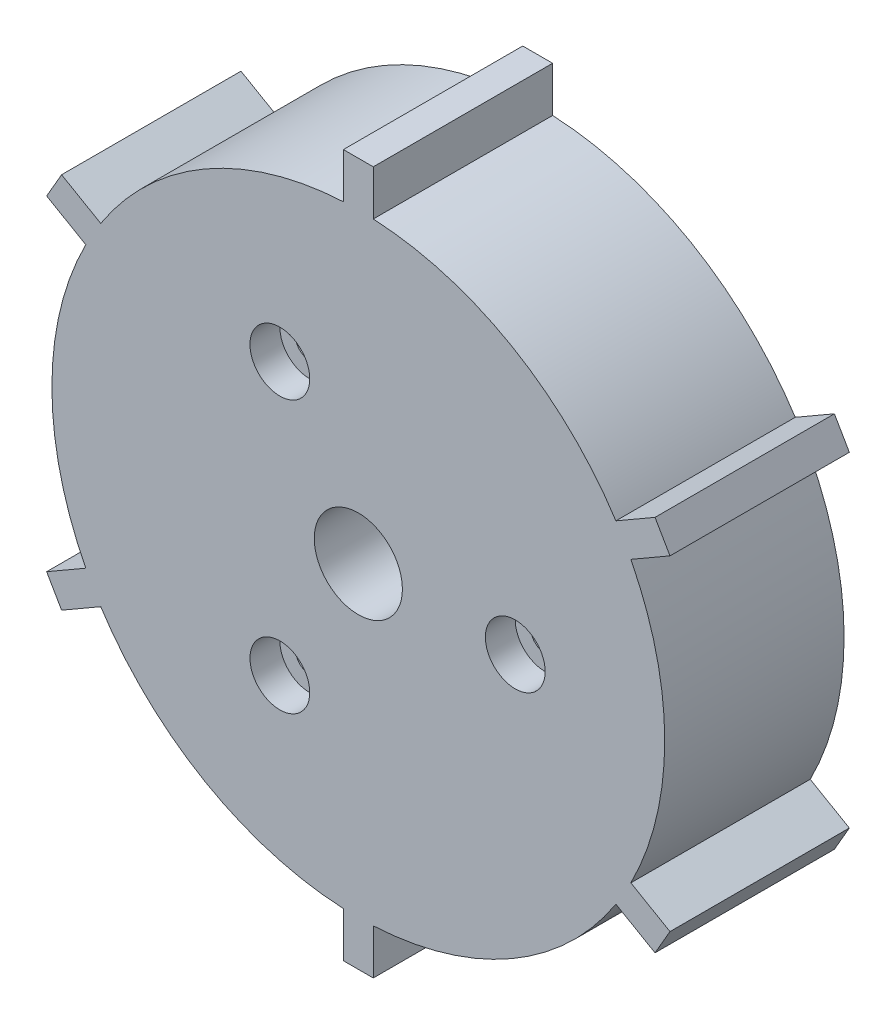
ISO-10303-21;
HEADER;
FILE_DESCRIPTION(('STEP AP214'),'2;1');
FILE_NAME('part.step','',(''),(''),'','','');
FILE_SCHEMA(('AUTOMOTIVE_DESIGN { 1 0 10303 214 1 1 1 1 }'));
ENDSEC;
DATA;
#1=APPLICATION_CONTEXT('core data for automotive mechanical design processes');
#2=APPLICATION_PROTOCOL_DEFINITION('international standard','automotive_design',2000,#1);
#3=PRODUCT_CONTEXT('',#1,'mechanical');
#4=PRODUCT('Part','Part','',(#3));
#5=PRODUCT_RELATED_PRODUCT_CATEGORY('part','',(#4));
#6=PRODUCT_DEFINITION_FORMATION('','',#4);
#7=PRODUCT_DEFINITION_CONTEXT('part definition',#1,'design');
#8=PRODUCT_DEFINITION('design','',#6,#7);
#9=PRODUCT_DEFINITION_SHAPE('','',#8);
#10=(LENGTH_UNIT() NAMED_UNIT(*) SI_UNIT(.MILLI.,.METRE.));
#11=(NAMED_UNIT(*) PLANE_ANGLE_UNIT() SI_UNIT($,.RADIAN.));
#12=(NAMED_UNIT(*) SI_UNIT($,.STERADIAN.) SOLID_ANGLE_UNIT());
#13=UNCERTAINTY_MEASURE_WITH_UNIT(LENGTH_MEASURE(1.E-05),#10,'distance_accuracy_value','');
#14=(GEOMETRIC_REPRESENTATION_CONTEXT(3) GLOBAL_UNCERTAINTY_ASSIGNED_CONTEXT((#13)) GLOBAL_UNIT_ASSIGNED_CONTEXT((#10,
#11,#12)) REPRESENTATION_CONTEXT('',''));
#15=CARTESIAN_POINT('',(0.,0.,0.));
#16=DIRECTION('',(0.,0.,1.));
#17=DIRECTION('',(1.,0.,0.));
#18=AXIS2_PLACEMENT_3D('',#15,#16,#17);
#19=CARTESIAN_POINT('',(0.,0.,0.));
#20=DIRECTION('',(0.,0.,1.));
#21=DIRECTION('',(1.,0.,0.));
#22=AXIS2_PLACEMENT_3D('',#19,#20,#21);
#23=PLANE('',#22);
#24=CARTESIAN_POINT('',(3.32503112446068E-12,0.,0.));
#25=DIRECTION('',(0.,0.,1.));
#26=DIRECTION('',(1.,0.,0.));
#27=AXIS2_PLACEMENT_3D('',#24,#25,#26);
#28=CIRCLE('',#27,2.94914886161455);
#29=CARTESIAN_POINT('',(2.94914886161788,0.,0.));
#30=VERTEX_POINT('',#29);
#31=EDGE_CURVE('E312',#30,#30,#28,.T.);
#32=ORIENTED_EDGE('',*,*,#31,.T.);
#33=EDGE_LOOP('',(#32));
#34=FACE_BOUND('',#33,.T.);
#35=CARTESIAN_POINT('',(-5.24999999999668,9.08999999999995,0.));
#36=DIRECTION('',(0.,0.,1.));
#37=DIRECTION('',(1.,0.,0.));
#38=AXIS2_PLACEMENT_3D('',#35,#36,#37);
#39=CIRCLE('',#38,0.95);
#40=CARTESIAN_POINT('',(-4.29999999999668,9.08999999999995,0.));
#41=VERTEX_POINT('',#40);
#42=EDGE_CURVE('E373',#41,#41,#39,.T.);
#43=ORIENTED_EDGE('',*,*,#42,.T.);
#44=EDGE_LOOP('',(#43));
#45=FACE_BOUND('',#44,.T.);
#46=CARTESIAN_POINT('',(10.5000000000033,0.,0.));
#47=DIRECTION('',(0.,0.,1.));
#48=DIRECTION('',(1.,0.,0.));
#49=AXIS2_PLACEMENT_3D('',#46,#47,#48);
#50=CIRCLE('',#49,0.949999999999999);
#51=CARTESIAN_POINT('',(11.4500000000033,0.,0.));
#52=VERTEX_POINT('',#51);
#53=EDGE_CURVE('E369',#52,#52,#50,.T.);
#54=ORIENTED_EDGE('',*,*,#53,.T.);
#55=EDGE_LOOP('',(#54));
#56=FACE_BOUND('',#55,.T.);
#57=CARTESIAN_POINT('',(-5.24999999999667,-9.09000000000005,0.));
#58=DIRECTION('',(0.,0.,1.));
#59=DIRECTION('',(1.,0.,0.));
#60=AXIS2_PLACEMENT_3D('',#57,#58,#59);
#61=CIRCLE('',#60,0.95);
#62=CARTESIAN_POINT('',(-4.29999999999667,-9.09000000000005,0.));
#63=VERTEX_POINT('',#62);
#64=EDGE_CURVE('E366',#63,#63,#61,.T.);
#65=ORIENTED_EDGE('',*,*,#64,.T.);
#66=EDGE_LOOP('',(#65));
#67=FACE_BOUND('',#66,.T.);
#68=CARTESIAN_POINT('',(3.32503112446068E-12,0.,0.));
#69=DIRECTION('',(0.,0.,1.));
#70=DIRECTION('',(1.,0.,0.));
#71=AXIS2_PLACEMENT_3D('',#68,#69,#70);
#72=CIRCLE('',#71,18.4999999999968);
#73=CARTESIAN_POINT('',(18.5000000000002,0.,0.));
#74=VERTEX_POINT('',#73);
#75=EDGE_CURVE('E11',#74,#74,#72,.T.);
#76=ORIENTED_EDGE('',*,*,#75,.F.);
#77=EDGE_LOOP('',(#76));
#78=FACE_BOUND('',#77,.T.);
#79=ADVANCED_FACE('F36',(#34,#45,#56,#67,#78),#23,.F.);
#80=CARTESIAN_POINT('',(-5.24999999999668,9.08999999999995,5.));
#81=DIRECTION('',(0.,0.,-1.));
#82=DIRECTION('',(-1.,0.,0.));
#83=AXIS2_PLACEMENT_3D('',#80,#81,#82);
#84=CYLINDRICAL_SURFACE('',#83,0.95);
#85=ORIENTED_EDGE('',*,*,#42,.F.);
#86=EDGE_LOOP('',(#85));
#87=FACE_BOUND('',#86,.T.);
#88=CARTESIAN_POINT('',(-5.24999999999668,9.08999999999995,3.));
#89=DIRECTION('',(0.,0.,1.));
#90=DIRECTION('',(1.,0.,0.));
#91=AXIS2_PLACEMENT_3D('',#88,#89,#90);
#92=CIRCLE('',#91,0.95);
#93=CARTESIAN_POINT('',(-4.29999999999668,9.08999999999995,3.));
#94=VERTEX_POINT('',#93);
#95=EDGE_CURVE('E370',#94,#94,#92,.T.);
#96=ORIENTED_EDGE('',*,*,#95,.T.);
#97=EDGE_LOOP('',(#96));
#98=FACE_BOUND('',#97,.T.);
#99=ADVANCED_FACE('F428',(#87,#98),#84,.F.);
#100=CARTESIAN_POINT('',(10.5000000000033,0.,5.));
#101=DIRECTION('',(0.,0.,-1.));
#102=DIRECTION('',(-1.,0.,0.));
#103=AXIS2_PLACEMENT_3D('',#100,#101,#102);
#104=CYLINDRICAL_SURFACE('',#103,0.949999999999999);
#105=ORIENTED_EDGE('',*,*,#53,.F.);
#106=EDGE_LOOP('',(#105));
#107=FACE_BOUND('',#106,.T.);
#108=CARTESIAN_POINT('',(10.5000000000033,0.,3.));
#109=DIRECTION('',(0.,0.,1.));
#110=DIRECTION('',(1.,0.,0.));
#111=AXIS2_PLACEMENT_3D('',#108,#109,#110);
#112=CIRCLE('',#111,0.949999999999999);
#113=CARTESIAN_POINT('',(11.4500000000033,0.,3.));
#114=VERTEX_POINT('',#113);
#115=EDGE_CURVE('E423',#114,#114,#112,.T.);
#116=ORIENTED_EDGE('',*,*,#115,.T.);
#117=EDGE_LOOP('',(#116));
#118=FACE_BOUND('',#117,.T.);
#119=ADVANCED_FACE('F563',(#107,#118),#104,.F.);
#120=CARTESIAN_POINT('',(-5.24999999999667,-9.09000000000005,5.));
#121=DIRECTION('',(0.,0.,-1.));
#122=DIRECTION('',(-1.,0.,0.));
#123=AXIS2_PLACEMENT_3D('',#120,#121,#122);
#124=CYLINDRICAL_SURFACE('',#123,0.95);
#125=ORIENTED_EDGE('',*,*,#64,.F.);
#126=EDGE_LOOP('',(#125));
#127=FACE_BOUND('',#126,.T.);
#128=CARTESIAN_POINT('',(-5.24999999999667,-9.09000000000005,3.));
#129=DIRECTION('',(0.,0.,1.));
#130=DIRECTION('',(1.,0.,0.));
#131=AXIS2_PLACEMENT_3D('',#128,#129,#130);
#132=CIRCLE('',#131,0.95);
#133=CARTESIAN_POINT('',(-4.29999999999667,-9.09000000000005,3.));
#134=VERTEX_POINT('',#133);
#135=EDGE_CURVE('E293',#134,#134,#132,.T.);
#136=ORIENTED_EDGE('',*,*,#135,.T.);
#137=EDGE_LOOP('',(#136));
#138=FACE_BOUND('',#137,.T.);
#139=ADVANCED_FACE('F38',(#127,#138),#124,.F.);
#140=CARTESIAN_POINT('',(-0.999999999996677,0.,5.));
#141=DIRECTION('',(1.,0.,0.));
#142=DIRECTION('',(0.,1.,0.));
#143=AXIS2_PLACEMENT_3D('',#140,#141,#142);
#144=PLANE('',#143);
#145=DIRECTION('',(0.,0.,-1.));
#146=VECTOR('',#145,1.);
#147=CARTESIAN_POINT('',(-0.999999999996675,23.4999999999999,5.));
#148=LINE('',#147,#146);
#149=CARTESIAN_POINT('',(-0.999999999996675,23.4999999999999,5.));
#150=VERTEX_POINT('',#149);
#151=CARTESIAN_POINT('',(-0.999999999996675,23.4999999999999,-7.));
#152=VERTEX_POINT('',#151);
#153=EDGE_CURVE('E51',#150,#152,#148,.T.);
#154=ORIENTED_EDGE('',*,*,#153,.T.);
#155=DIRECTION('',(0.,-1.,0.));
#156=VECTOR('',#155,1.);
#157=CARTESIAN_POINT('',(-0.999999999996677,0.,-7.));
#158=LINE('',#157,#156);
#159=CARTESIAN_POINT('',(-0.999999999996675,20.4755952294401,-7.));
#160=VERTEX_POINT('',#159);
#161=EDGE_CURVE('E215',#152,#160,#158,.T.);
#162=ORIENTED_EDGE('',*,*,#161,.T.);
#163=DIRECTION('',(0.,0.,-1.));
#164=VECTOR('',#163,1.);
#165=CARTESIAN_POINT('',(-0.999999999996675,20.4755952294401,5.));
#166=LINE('',#165,#164);
#167=CARTESIAN_POINT('',(-0.999999999996675,20.4755952294401,5.));
#168=VERTEX_POINT('',#167);
#169=EDGE_CURVE('E44',#168,#160,#166,.T.);
#170=ORIENTED_EDGE('',*,*,#169,.F.);
#171=DIRECTION('',(0.,-1.,0.));
#172=VECTOR('',#171,1.);
#173=CARTESIAN_POINT('',(-0.999999999996677,0.,5.));
#174=LINE('',#173,#172);
#175=EDGE_CURVE('E311',#150,#168,#174,.T.);
#176=ORIENTED_EDGE('',*,*,#175,.F.);
#177=EDGE_LOOP('',(#154,#162,#170,#176));
#178=FACE_BOUND('',#177,.T.);
#179=ADVANCED_FACE('F220',(#178),#144,.F.);
#180=CARTESIAN_POINT('',(3.32503112446068E-12,0.,5.));
#181=DIRECTION('',(0.,0.,-1.));
#182=DIRECTION('',(-1.,0.,0.));
#183=AXIS2_PLACEMENT_3D('',#180,#181,#182);
#184=CYLINDRICAL_SURFACE('',#183,20.4999999999968);
#185=ORIENTED_EDGE('',*,*,#169,.T.);
#186=CARTESIAN_POINT('',(3.32503112446068E-12,0.,-7.));
#187=DIRECTION('',(0.,0.,1.));
#188=DIRECTION('',(1.,0.,0.));
#189=AXIS2_PLACEMENT_3D('',#186,#187,#188);
#190=CIRCLE('',#189,20.4999999999968);
#191=CARTESIAN_POINT('',(-17.2323856262992,11.1038230185046,-7.));
#192=VERTEX_POINT('',#191);
#193=EDGE_CURVE('E202',#160,#192,#190,.T.);
#194=ORIENTED_EDGE('',*,*,#193,.T.);
#195=DIRECTION('',(0.,0.,-1.));
#196=VECTOR('',#195,1.);
#197=CARTESIAN_POINT('',(-17.2323856262992,11.1038230185046,5.));
#198=LINE('',#197,#196);
#199=CARTESIAN_POINT('',(-17.2323856262992,11.1038230185046,5.));
#200=VERTEX_POINT('',#199);
#201=EDGE_CURVE('E207',#200,#192,#198,.T.);
#202=ORIENTED_EDGE('',*,*,#201,.F.);
#203=CARTESIAN_POINT('',(3.32503112446068E-12,0.,5.));
#204=DIRECTION('',(0.,0.,1.));
#205=DIRECTION('',(1.,0.,0.));
#206=AXIS2_PLACEMENT_3D('',#203,#204,#205);
#207=CIRCLE('',#206,20.4999999999968);
#208=EDGE_CURVE('E203',#168,#200,#207,.T.);
#209=ORIENTED_EDGE('',*,*,#208,.F.);
#210=EDGE_LOOP('',(#185,#194,#202,#209));
#211=FACE_BOUND('',#210,.T.);
#212=ADVANCED_FACE('F200',(#211),#184,.T.);
#213=CARTESIAN_POINT('',(0.500000000000888,0.86602540378598,5.));
#214=DIRECTION('',(0.499999999999999,0.866025403784439,0.));
#215=DIRECTION('',(-0.866025403784439,0.499999999999999,0.));
#216=AXIS2_PLACEMENT_3D('',#213,#214,#215);
#217=PLANE('',#216);
#218=ORIENTED_EDGE('',*,*,#201,.T.);
#219=DIRECTION('',(0.866025403784439,-0.499999999999999,0.));
#220=VECTOR('',#219,1.);
#221=CARTESIAN_POINT('',(0.500000000000888,0.86602540378598,-7.));
#222=LINE('',#221,#220);
#223=CARTESIAN_POINT('',(-19.8515969889311,12.6160254037846,-7.));
#224=VERTEX_POINT('',#223);
#225=EDGE_CURVE('E218',#224,#192,#222,.T.);
#226=ORIENTED_EDGE('',*,*,#225,.F.);
#227=DIRECTION('',(0.,0.,-1.));
#228=VECTOR('',#227,1.);
#229=CARTESIAN_POINT('',(-19.8515969889311,12.6160254037846,5.));
#230=LINE('',#229,#228);
#231=CARTESIAN_POINT('',(-19.8515969889311,12.6160254037846,5.));
#232=VERTEX_POINT('',#231);
#233=EDGE_CURVE('E418',#232,#224,#230,.T.);
#234=ORIENTED_EDGE('',*,*,#233,.F.);
#235=DIRECTION('',(0.866025403784439,-0.499999999999999,0.));
#236=VECTOR('',#235,1.);
#237=CARTESIAN_POINT('',(0.500000000000888,0.86602540378598,5.));
#238=LINE('',#237,#236);
#239=EDGE_CURVE('E315',#232,#200,#238,.T.);
#240=ORIENTED_EDGE('',*,*,#239,.T.);
#241=EDGE_LOOP('',(#218,#226,#234,#240));
#242=FACE_BOUND('',#241,.T.);
#243=ADVANCED_FACE('F547',(#242),#217,.T.);
#244=CARTESIAN_POINT('',(-20.351596988932,11.7499999999986,5.));
#245=DIRECTION('',(0.866025403784439,-0.499999999999999,0.));
#246=DIRECTION('',(0.499999999999999,0.86602540378444,0.));
#247=AXIS2_PLACEMENT_3D('',#244,#245,#246);
#248=PLANE('',#247);
#249=ORIENTED_EDGE('',*,*,#233,.T.);
#250=DIRECTION('',(-0.499999999999999,-0.86602540378444,0.));
#251=VECTOR('',#250,1.);
#252=CARTESIAN_POINT('',(-20.351596988932,11.7499999999986,-7.));
#253=LINE('',#252,#251);
#254=CARTESIAN_POINT('',(-20.8515969889311,10.8839745962158,-7.));
#255=VERTEX_POINT('',#254);
#256=EDGE_CURVE('E224',#224,#255,#253,.T.);
#257=ORIENTED_EDGE('',*,*,#256,.T.);
#258=DIRECTION('',(0.,0.,-1.));
#259=VECTOR('',#258,1.);
#260=CARTESIAN_POINT('',(-20.8515969889311,10.8839745962158,5.));
#261=LINE('',#260,#259);
#262=CARTESIAN_POINT('',(-20.8515969889311,10.8839745962158,5.));
#263=VERTEX_POINT('',#262);
#264=EDGE_CURVE('E416',#263,#255,#261,.T.);
#265=ORIENTED_EDGE('',*,*,#264,.F.);
#266=DIRECTION('',(-0.499999999999999,-0.86602540378444,0.));
#267=VECTOR('',#266,1.);
#268=CARTESIAN_POINT('',(-20.351596988932,11.7499999999986,5.));
#269=LINE('',#268,#267);
#270=EDGE_CURVE('E318',#232,#263,#269,.T.);
#271=ORIENTED_EDGE('',*,*,#270,.F.);
#272=EDGE_LOOP('',(#249,#257,#265,#271));
#273=FACE_BOUND('',#272,.T.);
#274=ADVANCED_FACE('F544',(#273),#248,.F.);
#275=CARTESIAN_POINT('',(-0.49999999999908,-0.866025403782853,5.));
#276=DIRECTION('',(0.499999999999997,0.866025403784441,0.));
#277=DIRECTION('',(-0.866025403784441,0.499999999999997,0.));
#278=AXIS2_PLACEMENT_3D('',#275,#276,#277);
#279=PLANE('',#278);
#280=ORIENTED_EDGE('',*,*,#264,.T.);
#281=DIRECTION('',(0.866025403784441,-0.499999999999997,0.));
#282=VECTOR('',#281,1.);
#283=CARTESIAN_POINT('',(-0.49999999999908,-0.866025403782853,-7.));
#284=LINE('',#283,#282);
#285=CARTESIAN_POINT('',(-18.2323856262992,9.37177221093569,-7.));
#286=VERTEX_POINT('',#285);
#287=EDGE_CURVE('E227',#255,#286,#284,.T.);
#288=ORIENTED_EDGE('',*,*,#287,.T.);
#289=DIRECTION('',(0.,0.,-1.));
#290=VECTOR('',#289,1.);
#291=CARTESIAN_POINT('',(-18.2323856262992,9.37177221093569,5.));
#292=LINE('',#291,#290);
#293=CARTESIAN_POINT('',(-18.2323856262992,9.37177221093569,5.));
#294=VERTEX_POINT('',#293);
#295=EDGE_CURVE('E414',#294,#286,#292,.T.);
#296=ORIENTED_EDGE('',*,*,#295,.F.);
#297=DIRECTION('',(0.866025403784441,-0.499999999999997,0.));
#298=VECTOR('',#297,1.);
#299=CARTESIAN_POINT('',(-0.49999999999908,-0.866025403782853,5.));
#300=LINE('',#299,#298);
#301=EDGE_CURVE('E320',#263,#294,#300,.T.);
#302=ORIENTED_EDGE('',*,*,#301,.F.);
#303=EDGE_LOOP('',(#280,#288,#296,#302));
#304=FACE_BOUND('',#303,.T.);
#305=ADVANCED_FACE('F541',(#304),#279,.F.);
#306=CARTESIAN_POINT('',(3.32503112446068E-12,0.,5.));
#307=DIRECTION('',(0.,0.,-1.));
#308=DIRECTION('',(-1.,0.,0.));
#309=AXIS2_PLACEMENT_3D('',#306,#307,#308);
#310=CYLINDRICAL_SURFACE('',#309,20.4999999999968);
#311=ORIENTED_EDGE('',*,*,#295,.T.);
#312=CARTESIAN_POINT('',(3.32503112446068E-12,0.,-7.));
#313=DIRECTION('',(0.,0.,1.));
#314=DIRECTION('',(1.,0.,0.));
#315=AXIS2_PLACEMENT_3D('',#312,#313,#314);
#316=CIRCLE('',#315,20.4999999999968);
#317=CARTESIAN_POINT('',(-18.2323856262993,-9.37177221093554,-7.));
#318=VERTEX_POINT('',#317);
#319=EDGE_CURVE('E230',#286,#318,#316,.T.);
#320=ORIENTED_EDGE('',*,*,#319,.T.);
#321=DIRECTION('',(0.,0.,-1.));
#322=VECTOR('',#321,1.);
#323=CARTESIAN_POINT('',(-18.2323856262993,-9.37177221093554,5.));
#324=LINE('',#323,#322);
#325=CARTESIAN_POINT('',(-18.2323856262993,-9.37177221093554,5.));
#326=VERTEX_POINT('',#325);
#327=EDGE_CURVE('E412',#326,#318,#324,.T.);
#328=ORIENTED_EDGE('',*,*,#327,.F.);
#329=CARTESIAN_POINT('',(3.32503112446068E-12,0.,5.));
#330=DIRECTION('',(0.,0.,1.));
#331=DIRECTION('',(1.,0.,0.));
#332=AXIS2_PLACEMENT_3D('',#329,#330,#331);
#333=CIRCLE('',#332,20.4999999999968);
#334=EDGE_CURVE('E322',#294,#326,#333,.T.);
#335=ORIENTED_EDGE('',*,*,#334,.F.);
#336=EDGE_LOOP('',(#311,#320,#328,#335));
#337=FACE_BOUND('',#336,.T.);
#338=ADVANCED_FACE('F536',(#337),#310,.T.);
#339=CARTESIAN_POINT('',(-0.499999999999246,0.866025403783128,5.));
#340=DIRECTION('',(-0.500000000000002,0.866025403784437,0.));
#341=DIRECTION('',(-0.866025403784437,-0.500000000000002,0.));
#342=AXIS2_PLACEMENT_3D('',#339,#340,#341);
#343=PLANE('',#342);
#344=ORIENTED_EDGE('',*,*,#327,.T.);
#345=DIRECTION('',(0.866025403784437,0.500000000000002,0.));
#346=VECTOR('',#345,1.);
#347=CARTESIAN_POINT('',(-0.499999999999246,0.866025403783128,-7.));
#348=LINE('',#347,#346);
#349=CARTESIAN_POINT('',(-20.8515969889311,-10.8839745962155,-7.));
#350=VERTEX_POINT('',#349);
#351=EDGE_CURVE('E233',#350,#318,#348,.T.);
#352=ORIENTED_EDGE('',*,*,#351,.F.);
#353=DIRECTION('',(0.,0.,-1.));
#354=VECTOR('',#353,1.);
#355=CARTESIAN_POINT('',(-20.8515969889311,-10.8839745962155,5.));
#356=LINE('',#355,#354);
#357=CARTESIAN_POINT('',(-20.8515969889311,-10.8839745962155,5.));
#358=VERTEX_POINT('',#357);
#359=EDGE_CURVE('E410',#358,#350,#356,.T.);
#360=ORIENTED_EDGE('',*,*,#359,.F.);
#361=DIRECTION('',(0.866025403784437,0.500000000000002,0.));
#362=VECTOR('',#361,1.);
#363=CARTESIAN_POINT('',(-0.499999999999246,0.866025403783128,5.));
#364=LINE('',#363,#362);
#365=EDGE_CURVE('E324',#358,#326,#364,.T.);
#366=ORIENTED_EDGE('',*,*,#365,.T.);
#367=EDGE_LOOP('',(#344,#352,#360,#366));
#368=FACE_BOUND('',#367,.T.);
#369=ADVANCED_FACE('F531',(#368),#343,.T.);
#370=CARTESIAN_POINT('',(-20.3515969889319,-11.7499999999986,5.));
#371=DIRECTION('',(0.866025403784438,0.5,0.));
#372=DIRECTION('',(-0.5,0.866025403784438,0.));
#373=AXIS2_PLACEMENT_3D('',#370,#371,#372);
#374=PLANE('',#373);
#375=ORIENTED_EDGE('',*,*,#359,.T.);
#376=DIRECTION('',(0.5,-0.866025403784438,0.));
#377=VECTOR('',#376,1.);
#378=CARTESIAN_POINT('',(-20.3515969889319,-11.7499999999986,-7.));
#379=LINE('',#378,#377);
#380=CARTESIAN_POINT('',(-19.8515969889311,-12.6160254037844,-7.));
#381=VERTEX_POINT('',#380);
#382=EDGE_CURVE('E236',#350,#381,#379,.T.);
#383=ORIENTED_EDGE('',*,*,#382,.T.);
#384=DIRECTION('',(0.,0.,-1.));
#385=VECTOR('',#384,1.);
#386=CARTESIAN_POINT('',(-19.8515969889311,-12.6160254037844,5.));
#387=LINE('',#386,#385);
#388=CARTESIAN_POINT('',(-19.8515969889311,-12.6160254037844,5.));
#389=VERTEX_POINT('',#388);
#390=EDGE_CURVE('E408',#389,#381,#387,.T.);
#391=ORIENTED_EDGE('',*,*,#390,.F.);
#392=DIRECTION('',(0.5,-0.866025403784438,0.));
#393=VECTOR('',#392,1.);
#394=CARTESIAN_POINT('',(-20.3515969889319,-11.7499999999986,5.));
#395=LINE('',#394,#393);
#396=EDGE_CURVE('E327',#358,#389,#395,.T.);
#397=ORIENTED_EDGE('',*,*,#396,.F.);
#398=EDGE_LOOP('',(#375,#383,#391,#397));
#399=FACE_BOUND('',#398,.T.);
#400=ADVANCED_FACE('F526',(#399),#374,.F.);
#401=CARTESIAN_POINT('',(0.500000000000762,-0.866025403785754,5.));
#402=DIRECTION('',(-0.500000000000002,0.866025403784437,0.));
#403=DIRECTION('',(-0.866025403784437,-0.500000000000002,0.));
#404=AXIS2_PLACEMENT_3D('',#401,#402,#403);
#405=PLANE('',#404);
#406=ORIENTED_EDGE('',*,*,#390,.T.);
#407=DIRECTION('',(0.866025403784437,0.500000000000002,0.));
#408=VECTOR('',#407,1.);
#409=CARTESIAN_POINT('',(0.500000000000762,-0.866025403785754,-7.));
#410=LINE('',#409,#408);
#411=CARTESIAN_POINT('',(-17.2323856262993,-11.1038230185044,-7.));
#412=VERTEX_POINT('',#411);
#413=EDGE_CURVE('E239',#381,#412,#410,.T.);
#414=ORIENTED_EDGE('',*,*,#413,.T.);
#415=DIRECTION('',(0.,0.,-1.));
#416=VECTOR('',#415,1.);
#417=CARTESIAN_POINT('',(-17.2323856262993,-11.1038230185044,5.));
#418=LINE('',#417,#416);
#419=CARTESIAN_POINT('',(-17.2323856262993,-11.1038230185044,5.));
#420=VERTEX_POINT('',#419);
#421=EDGE_CURVE('E406',#420,#412,#418,.T.);
#422=ORIENTED_EDGE('',*,*,#421,.F.);
#423=DIRECTION('',(0.866025403784437,0.500000000000002,0.));
#424=VECTOR('',#423,1.);
#425=CARTESIAN_POINT('',(0.500000000000762,-0.866025403785754,5.));
#426=LINE('',#425,#424);
#427=EDGE_CURVE('E329',#389,#420,#426,.T.);
#428=ORIENTED_EDGE('',*,*,#427,.F.);
#429=EDGE_LOOP('',(#406,#414,#422,#428));
#430=FACE_BOUND('',#429,.T.);
#431=ADVANCED_FACE('F522',(#430),#405,.F.);
#432=CARTESIAN_POINT('',(3.32503112446068E-12,0.,5.));
#433=DIRECTION('',(0.,0.,-1.));
#434=DIRECTION('',(-1.,0.,0.));
#435=AXIS2_PLACEMENT_3D('',#432,#433,#434);
#436=CYLINDRICAL_SURFACE('',#435,20.4999999999968);
#437=ORIENTED_EDGE('',*,*,#421,.T.);
#438=CARTESIAN_POINT('',(3.32503112446068E-12,0.,-7.));
#439=DIRECTION('',(0.,0.,1.));
#440=DIRECTION('',(1.,0.,0.));
#441=AXIS2_PLACEMENT_3D('',#438,#439,#440);
#442=CIRCLE('',#441,20.4999999999968);
#443=CARTESIAN_POINT('',(-0.999999999996675,-20.4755952294402,-7.));
#444=VERTEX_POINT('',#443);
#445=EDGE_CURVE('E242',#412,#444,#442,.T.);
#446=ORIENTED_EDGE('',*,*,#445,.T.);
#447=DIRECTION('',(0.,0.,-1.));
#448=VECTOR('',#447,1.);
#449=CARTESIAN_POINT('',(-0.999999999996675,-20.4755952294402,5.));
#450=LINE('',#449,#448);
#451=CARTESIAN_POINT('',(-0.999999999996675,-20.4755952294402,5.));
#452=VERTEX_POINT('',#451);
#453=EDGE_CURVE('E404',#452,#444,#450,.T.);
#454=ORIENTED_EDGE('',*,*,#453,.F.);
#455=CARTESIAN_POINT('',(3.32503112446068E-12,0.,5.));
#456=DIRECTION('',(0.,0.,1.));
#457=DIRECTION('',(1.,0.,0.));
#458=AXIS2_PLACEMENT_3D('',#455,#456,#457);
#459=CIRCLE('',#458,20.4999999999968);
#460=EDGE_CURVE('E331',#420,#452,#459,.T.);
#461=ORIENTED_EDGE('',*,*,#460,.F.);
#462=EDGE_LOOP('',(#437,#446,#454,#461));
#463=FACE_BOUND('',#462,.T.);
#464=ADVANCED_FACE('F517',(#463),#436,.T.);
#465=CARTESIAN_POINT('',(-0.999999999996706,0.,5.));
#466=DIRECTION('',(-1.,0.,0.));
#467=DIRECTION('',(0.,-1.,0.));
#468=AXIS2_PLACEMENT_3D('',#465,#466,#467);
#469=PLANE('',#468);
#470=ORIENTED_EDGE('',*,*,#453,.T.);
#471=DIRECTION('',(0.,1.,0.));
#472=VECTOR('',#471,1.);
#473=CARTESIAN_POINT('',(-0.999999999996706,0.,-7.));
#474=LINE('',#473,#472);
#475=CARTESIAN_POINT('',(-0.999999999996675,-23.5000000000001,-7.));
#476=VERTEX_POINT('',#475);
#477=EDGE_CURVE('E245',#476,#444,#474,.T.);
#478=ORIENTED_EDGE('',*,*,#477,.F.);
#479=DIRECTION('',(0.,0.,-1.));
#480=VECTOR('',#479,1.);
#481=CARTESIAN_POINT('',(-0.999999999996675,-23.5000000000001,5.));
#482=LINE('',#481,#480);
#483=CARTESIAN_POINT('',(-0.999999999996675,-23.5000000000001,5.));
#484=VERTEX_POINT('',#483);
#485=EDGE_CURVE('E402',#484,#476,#482,.T.);
#486=ORIENTED_EDGE('',*,*,#485,.F.);
#487=DIRECTION('',(0.,1.,0.));
#488=VECTOR('',#487,1.);
#489=CARTESIAN_POINT('',(-0.999999999996706,0.,5.));
#490=LINE('',#489,#488);
#491=EDGE_CURVE('E333',#484,#452,#490,.T.);
#492=ORIENTED_EDGE('',*,*,#491,.T.);
#493=EDGE_LOOP('',(#470,#478,#486,#492));
#494=FACE_BOUND('',#493,.T.);
#495=ADVANCED_FACE('F548',(#494),#469,.T.);
#496=CARTESIAN_POINT('',(0.,-23.5000000000001,5.));
#497=DIRECTION('',(0.,1.,0.));
#498=DIRECTION('',(0.,0.,1.));
#499=AXIS2_PLACEMENT_3D('',#496,#497,#498);
#500=PLANE('',#499);
#501=ORIENTED_EDGE('',*,*,#485,.T.);
#502=DIRECTION('',(1.,0.,0.));
#503=VECTOR('',#502,1.);
#504=CARTESIAN_POINT('',(0.,-23.5000000000001,-7.));
#505=LINE('',#504,#503);
#506=CARTESIAN_POINT('',(1.00000000000333,-23.5000000000001,-7.));
#507=VERTEX_POINT('',#506);
#508=EDGE_CURVE('E248',#476,#507,#505,.T.);
#509=ORIENTED_EDGE('',*,*,#508,.T.);
#510=DIRECTION('',(0.,0.,-1.));
#511=VECTOR('',#510,1.);
#512=CARTESIAN_POINT('',(1.00000000000333,-23.5000000000001,5.));
#513=LINE('',#512,#511);
#514=CARTESIAN_POINT('',(1.00000000000333,-23.5000000000001,5.));
#515=VERTEX_POINT('',#514);
#516=EDGE_CURVE('E400',#515,#507,#513,.T.);
#517=ORIENTED_EDGE('',*,*,#516,.F.);
#518=DIRECTION('',(1.,0.,0.));
#519=VECTOR('',#518,1.);
#520=CARTESIAN_POINT('',(0.,-23.5000000000001,5.));
#521=LINE('',#520,#519);
#522=EDGE_CURVE('E336',#484,#515,#521,.T.);
#523=ORIENTED_EDGE('',*,*,#522,.F.);
#524=EDGE_LOOP('',(#501,#509,#517,#523));
#525=FACE_BOUND('',#524,.T.);
#526=ADVANCED_FACE('F509',(#525),#500,.F.);
#527=CARTESIAN_POINT('',(1.0000000000033,0.,5.));
#528=DIRECTION('',(-1.,0.,0.));
#529=DIRECTION('',(0.,-1.,0.));
#530=AXIS2_PLACEMENT_3D('',#527,#528,#529);
#531=PLANE('',#530);
#532=ORIENTED_EDGE('',*,*,#516,.T.);
#533=DIRECTION('',(0.,1.,0.));
#534=VECTOR('',#533,1.);
#535=CARTESIAN_POINT('',(1.0000000000033,0.,-7.));
#536=LINE('',#535,#534);
#537=CARTESIAN_POINT('',(1.00000000000333,-20.4755952294402,-7.));
#538=VERTEX_POINT('',#537);
#539=EDGE_CURVE('E251',#507,#538,#536,.T.);
#540=ORIENTED_EDGE('',*,*,#539,.T.);
#541=DIRECTION('',(0.,0.,-1.));
#542=VECTOR('',#541,1.);
#543=CARTESIAN_POINT('',(1.00000000000333,-20.4755952294402,5.));
#544=LINE('',#543,#542);
#545=CARTESIAN_POINT('',(1.00000000000333,-20.4755952294402,5.));
#546=VERTEX_POINT('',#545);
#547=EDGE_CURVE('E398',#546,#538,#544,.T.);
#548=ORIENTED_EDGE('',*,*,#547,.F.);
#549=DIRECTION('',(0.,1.,0.));
#550=VECTOR('',#549,1.);
#551=CARTESIAN_POINT('',(1.0000000000033,0.,5.));
#552=LINE('',#551,#550);
#553=EDGE_CURVE('E338',#515,#546,#552,.T.);
#554=ORIENTED_EDGE('',*,*,#553,.F.);
#555=EDGE_LOOP('',(#532,#540,#548,#554));
#556=FACE_BOUND('',#555,.T.);
#557=ADVANCED_FACE('F504',(#556),#531,.F.);
#558=CARTESIAN_POINT('',(3.32503112446068E-12,0.,5.));
#559=DIRECTION('',(0.,0.,-1.));
#560=DIRECTION('',(-1.,0.,0.));
#561=AXIS2_PLACEMENT_3D('',#558,#559,#560);
#562=CYLINDRICAL_SURFACE('',#561,20.4999999999968);
#563=ORIENTED_EDGE('',*,*,#547,.T.);
#564=CARTESIAN_POINT('',(3.32503112446068E-12,0.,-7.));
#565=DIRECTION('',(0.,0.,1.));
#566=DIRECTION('',(1.,0.,0.));
#567=AXIS2_PLACEMENT_3D('',#564,#565,#566);
#568=CIRCLE('',#567,20.4999999999968);
#569=CARTESIAN_POINT('',(17.232385626306,-11.1038230185044,-7.));
#570=VERTEX_POINT('',#569);
#571=EDGE_CURVE('E254',#538,#570,#568,.T.);
#572=ORIENTED_EDGE('',*,*,#571,.T.);
#573=DIRECTION('',(0.,0.,-1.));
#574=VECTOR('',#573,1.);
#575=CARTESIAN_POINT('',(17.232385626306,-11.1038230185044,5.));
#576=LINE('',#575,#574);
#577=CARTESIAN_POINT('',(17.232385626306,-11.1038230185044,5.));
#578=VERTEX_POINT('',#577);
#579=EDGE_CURVE('E396',#578,#570,#576,.T.);
#580=ORIENTED_EDGE('',*,*,#579,.F.);
#581=CARTESIAN_POINT('',(3.32503112446068E-12,0.,5.));
#582=DIRECTION('',(0.,0.,1.));
#583=DIRECTION('',(1.,0.,0.));
#584=AXIS2_PLACEMENT_3D('',#581,#582,#583);
#585=CIRCLE('',#584,20.4999999999968);
#586=EDGE_CURVE('E340',#546,#578,#585,.T.);
#587=ORIENTED_EDGE('',*,*,#586,.F.);
#588=EDGE_LOOP('',(#563,#572,#580,#587));
#589=FACE_BOUND('',#588,.T.);
#590=ADVANCED_FACE('F499',(#589),#562,.T.);
#591=CARTESIAN_POINT('',(-0.499999999999121,-0.866025403782918,5.));
#592=DIRECTION('',(-0.5,-0.866025403784439,0.));
#593=DIRECTION('',(0.866025403784439,-0.5,0.));
#594=AXIS2_PLACEMENT_3D('',#591,#592,#593);
#595=PLANE('',#594);
#596=ORIENTED_EDGE('',*,*,#579,.T.);
#597=DIRECTION('',(-0.866025403784439,0.5,0.));
#598=VECTOR('',#597,1.);
#599=CARTESIAN_POINT('',(-0.499999999999121,-0.866025403782918,-7.));
#600=LINE('',#599,#598);
#601=CARTESIAN_POINT('',(19.8515969889375,-12.6160254037842,-7.));
#602=VERTEX_POINT('',#601);
#603=EDGE_CURVE('E257',#602,#570,#600,.T.);
#604=ORIENTED_EDGE('',*,*,#603,.F.);
#605=DIRECTION('',(0.,0.,-1.));
#606=VECTOR('',#605,1.);
#607=CARTESIAN_POINT('',(19.8515969889375,-12.6160254037842,5.));
#608=LINE('',#607,#606);
#609=CARTESIAN_POINT('',(19.8515969889375,-12.6160254037842,5.));
#610=VERTEX_POINT('',#609);
#611=EDGE_CURVE('E394',#610,#602,#608,.T.);
#612=ORIENTED_EDGE('',*,*,#611,.F.);
#613=DIRECTION('',(-0.866025403784439,0.5,0.));
#614=VECTOR('',#613,1.);
#615=CARTESIAN_POINT('',(-0.499999999999121,-0.866025403782918,5.));
#616=LINE('',#615,#614);
#617=EDGE_CURVE('E342',#610,#578,#616,.T.);
#618=ORIENTED_EDGE('',*,*,#617,.T.);
#619=EDGE_LOOP('',(#596,#604,#612,#618));
#620=FACE_BOUND('',#619,.T.);
#621=ADVANCED_FACE('F494',(#620),#595,.T.);
#622=CARTESIAN_POINT('',(20.3515969889366,-11.7500000000013,5.));
#623=DIRECTION('',(0.866025403784438,-0.5,0.));
#624=DIRECTION('',(0.5,0.866025403784438,0.));
#625=AXIS2_PLACEMENT_3D('',#622,#623,#624);
#626=PLANE('',#625);
#627=ORIENTED_EDGE('',*,*,#611,.T.);
#628=DIRECTION('',(-0.5,-0.866025403784438,0.));
#629=VECTOR('',#628,1.);
#630=CARTESIAN_POINT('',(20.3515969889366,-11.7500000000013,-7.));
#631=LINE('',#630,#629);
#632=CARTESIAN_POINT('',(20.8515969889375,-10.8839745962154,-7.));
#633=VERTEX_POINT('',#632);
#634=EDGE_CURVE('E260',#633,#602,#631,.T.);
#635=ORIENTED_EDGE('',*,*,#634,.F.);
#636=DIRECTION('',(0.,0.,-1.));
#637=VECTOR('',#636,1.);
#638=CARTESIAN_POINT('',(20.8515969889375,-10.8839745962154,5.));
#639=LINE('',#638,#637);
#640=CARTESIAN_POINT('',(20.8515969889375,-10.8839745962154,5.));
#641=VERTEX_POINT('',#640);
#642=EDGE_CURVE('E392',#641,#633,#639,.T.);
#643=ORIENTED_EDGE('',*,*,#642,.F.);
#644=DIRECTION('',(-0.5,-0.866025403784438,0.));
#645=VECTOR('',#644,1.);
#646=CARTESIAN_POINT('',(20.3515969889366,-11.7500000000013,5.));
#647=LINE('',#646,#645);
#648=EDGE_CURVE('E345',#641,#610,#647,.T.);
#649=ORIENTED_EDGE('',*,*,#648,.T.);
#650=EDGE_LOOP('',(#627,#635,#643,#649));
#651=FACE_BOUND('',#650,.T.);
#652=ADVANCED_FACE('F490',(#651),#626,.T.);
#653=CARTESIAN_POINT('',(0.500000000000784,0.866025403785812,5.));
#654=DIRECTION('',(-0.499999999999993,-0.866025403784443,0.));
#655=DIRECTION('',(0.866025403784443,-0.499999999999993,0.));
#656=AXIS2_PLACEMENT_3D('',#653,#654,#655);
#657=PLANE('',#656);
#658=ORIENTED_EDGE('',*,*,#642,.T.);
#659=DIRECTION('',(-0.866025403784443,0.499999999999993,0.));
#660=VECTOR('',#659,1.);
#661=CARTESIAN_POINT('',(0.500000000000784,0.866025403785812,-7.));
#662=LINE('',#661,#660);
#663=CARTESIAN_POINT('',(18.232385626306,-9.37177221093555,-7.));
#664=VERTEX_POINT('',#663);
#665=EDGE_CURVE('E263',#633,#664,#662,.T.);
#666=ORIENTED_EDGE('',*,*,#665,.T.);
#667=DIRECTION('',(0.,0.,-1.));
#668=VECTOR('',#667,1.);
#669=CARTESIAN_POINT('',(18.232385626306,-9.37177221093555,5.));
#670=LINE('',#669,#668);
#671=CARTESIAN_POINT('',(18.232385626306,-9.37177221093555,5.));
#672=VERTEX_POINT('',#671);
#673=EDGE_CURVE('E390',#672,#664,#670,.T.);
#674=ORIENTED_EDGE('',*,*,#673,.F.);
#675=DIRECTION('',(-0.866025403784443,0.499999999999993,0.));
#676=VECTOR('',#675,1.);
#677=CARTESIAN_POINT('',(0.500000000000784,0.866025403785812,5.));
#678=LINE('',#677,#676);
#679=EDGE_CURVE('E348',#641,#672,#678,.T.);
#680=ORIENTED_EDGE('',*,*,#679,.F.);
#681=EDGE_LOOP('',(#658,#666,#674,#680));
#682=FACE_BOUND('',#681,.T.);
#683=ADVANCED_FACE('F485',(#682),#657,.F.);
#684=CARTESIAN_POINT('',(3.32503112446068E-12,0.,5.));
#685=DIRECTION('',(0.,0.,-1.));
#686=DIRECTION('',(-1.,0.,0.));
#687=AXIS2_PLACEMENT_3D('',#684,#685,#686);
#688=CYLINDRICAL_SURFACE('',#687,20.4999999999968);
#689=ORIENTED_EDGE('',*,*,#673,.T.);
#690=CARTESIAN_POINT('',(3.32503112446068E-12,0.,-7.));
#691=DIRECTION('',(0.,0.,1.));
#692=DIRECTION('',(1.,0.,0.));
#693=AXIS2_PLACEMENT_3D('',#690,#691,#692);
#694=CIRCLE('',#693,20.4999999999968);
#695=CARTESIAN_POINT('',(18.2323856263059,9.3717722109357,-7.));
#696=VERTEX_POINT('',#695);
#697=EDGE_CURVE('E266',#664,#696,#694,.T.);
#698=ORIENTED_EDGE('',*,*,#697,.T.);
#699=DIRECTION('',(0.,0.,-1.));
#700=VECTOR('',#699,1.);
#701=CARTESIAN_POINT('',(18.2323856263059,9.3717722109357,5.));
#702=LINE('',#701,#700);
#703=CARTESIAN_POINT('',(18.2323856263059,9.3717722109357,5.));
#704=VERTEX_POINT('',#703);
#705=EDGE_CURVE('E388',#704,#696,#702,.T.);
#706=ORIENTED_EDGE('',*,*,#705,.F.);
#707=CARTESIAN_POINT('',(3.32503112446068E-12,0.,5.));
#708=DIRECTION('',(0.,0.,1.));
#709=DIRECTION('',(1.,0.,0.));
#710=AXIS2_PLACEMENT_3D('',#707,#708,#709);
#711=CIRCLE('',#710,20.4999999999968);
#712=EDGE_CURVE('E350',#672,#704,#711,.T.);
#713=ORIENTED_EDGE('',*,*,#712,.F.);
#714=EDGE_LOOP('',(#689,#698,#706,#713));
#715=FACE_BOUND('',#714,.T.);
#716=ADVANCED_FACE('F481',(#715),#688,.T.);
#717=CARTESIAN_POINT('',(0.500000000000783,-0.866025403785794,5.));
#718=DIRECTION('',(0.5,-0.866025403784438,0.));
#719=DIRECTION('',(0.866025403784438,0.5,0.));
#720=AXIS2_PLACEMENT_3D('',#717,#718,#719);
#721=PLANE('',#720);
#722=ORIENTED_EDGE('',*,*,#705,.T.);
#723=DIRECTION('',(-0.866025403784439,-0.5,0.));
#724=VECTOR('',#723,1.);
#725=CARTESIAN_POINT('',(0.500000000000783,-0.866025403785794,-7.));
#726=LINE('',#725,#724);
#727=CARTESIAN_POINT('',(20.8515969889375,10.8839745962156,-7.));
#728=VERTEX_POINT('',#727);
#729=EDGE_CURVE('E269',#728,#696,#726,.T.);
#730=ORIENTED_EDGE('',*,*,#729,.F.);
#731=DIRECTION('',(0.,0.,-1.));
#732=VECTOR('',#731,1.);
#733=CARTESIAN_POINT('',(20.8515969889375,10.8839745962156,5.));
#734=LINE('',#733,#732);
#735=CARTESIAN_POINT('',(20.8515969889375,10.8839745962156,5.));
#736=VERTEX_POINT('',#735);
#737=EDGE_CURVE('E386',#736,#728,#734,.T.);
#738=ORIENTED_EDGE('',*,*,#737,.F.);
#739=DIRECTION('',(-0.866025403784439,-0.5,0.));
#740=VECTOR('',#739,1.);
#741=CARTESIAN_POINT('',(0.500000000000783,-0.866025403785794,5.));
#742=LINE('',#741,#740);
#743=EDGE_CURVE('E352',#736,#704,#742,.T.);
#744=ORIENTED_EDGE('',*,*,#743,.T.);
#745=EDGE_LOOP('',(#722,#730,#738,#744));
#746=FACE_BOUND('',#745,.T.);
#747=ADVANCED_FACE('F476',(#746),#721,.T.);
#748=CARTESIAN_POINT('',(20.3515969889367,11.7500000000014,5.));
#749=DIRECTION('',(0.866025403784438,0.5,0.));
#750=DIRECTION('',(-0.5,0.866025403784438,0.));
#751=AXIS2_PLACEMENT_3D('',#748,#749,#750);
#752=PLANE('',#751);
#753=ORIENTED_EDGE('',*,*,#737,.T.);
#754=DIRECTION('',(0.5,-0.866025403784438,0.));
#755=VECTOR('',#754,1.);
#756=CARTESIAN_POINT('',(20.3515969889367,11.7500000000014,-7.));
#757=LINE('',#756,#755);
#758=CARTESIAN_POINT('',(19.8515969889375,12.6160254037845,-7.));
#759=VERTEX_POINT('',#758);
#760=EDGE_CURVE('E272',#759,#728,#757,.T.);
#761=ORIENTED_EDGE('',*,*,#760,.F.);
#762=DIRECTION('',(0.,0.,-1.));
#763=VECTOR('',#762,1.);
#764=CARTESIAN_POINT('',(19.8515969889375,12.6160254037845,5.));
#765=LINE('',#764,#763);
#766=CARTESIAN_POINT('',(19.8515969889375,12.6160254037845,5.));
#767=VERTEX_POINT('',#766);
#768=EDGE_CURVE('E384',#767,#759,#765,.T.);
#769=ORIENTED_EDGE('',*,*,#768,.F.);
#770=DIRECTION('',(0.5,-0.866025403784438,0.));
#771=VECTOR('',#770,1.);
#772=CARTESIAN_POINT('',(20.3515969889367,11.7500000000014,5.));
#773=LINE('',#772,#771);
#774=EDGE_CURVE('E355',#767,#736,#773,.T.);
#775=ORIENTED_EDGE('',*,*,#774,.T.);
#776=EDGE_LOOP('',(#753,#761,#769,#775));
#777=FACE_BOUND('',#776,.T.);
#778=ADVANCED_FACE('F472',(#777),#752,.T.);
#779=CARTESIAN_POINT('',(-0.499999999999216,0.86602540378308,5.));
#780=DIRECTION('',(0.5,-0.866025403784438,0.));
#781=DIRECTION('',(0.866025403784438,0.5,0.));
#782=AXIS2_PLACEMENT_3D('',#779,#780,#781);
#783=PLANE('',#782);
#784=ORIENTED_EDGE('',*,*,#768,.T.);
#785=DIRECTION('',(-0.866025403784438,-0.5,0.));
#786=VECTOR('',#785,1.);
#787=CARTESIAN_POINT('',(-0.499999999999216,0.86602540378308,-7.));
#788=LINE('',#787,#786);
#789=CARTESIAN_POINT('',(17.2323856263058,11.1038230185046,-7.));
#790=VERTEX_POINT('',#789);
#791=EDGE_CURVE('E275',#759,#790,#788,.T.);
#792=ORIENTED_EDGE('',*,*,#791,.T.);
#793=DIRECTION('',(0.,0.,-1.));
#794=VECTOR('',#793,1.);
#795=CARTESIAN_POINT('',(17.2323856263058,11.1038230185046,5.));
#796=LINE('',#795,#794);
#797=CARTESIAN_POINT('',(17.2323856263058,11.1038230185046,5.));
#798=VERTEX_POINT('',#797);
#799=EDGE_CURVE('E382',#798,#790,#796,.T.);
#800=ORIENTED_EDGE('',*,*,#799,.F.);
#801=DIRECTION('',(-0.866025403784438,-0.5,0.));
#802=VECTOR('',#801,1.);
#803=CARTESIAN_POINT('',(-0.499999999999216,0.86602540378308,5.));
#804=LINE('',#803,#802);
#805=EDGE_CURVE('E358',#767,#798,#804,.T.);
#806=ORIENTED_EDGE('',*,*,#805,.F.);
#807=EDGE_LOOP('',(#784,#792,#800,#806));
#808=FACE_BOUND('',#807,.T.);
#809=ADVANCED_FACE('F467',(#808),#783,.F.);
#810=CARTESIAN_POINT('',(3.32503112446068E-12,0.,5.));
#811=DIRECTION('',(0.,0.,-1.));
#812=DIRECTION('',(-1.,0.,0.));
#813=AXIS2_PLACEMENT_3D('',#810,#811,#812);
#814=CYLINDRICAL_SURFACE('',#813,20.4999999999968);
#815=ORIENTED_EDGE('',*,*,#799,.T.);
#816=CARTESIAN_POINT('',(3.32503112446068E-12,0.,-7.));
#817=DIRECTION('',(0.,0.,1.));
#818=DIRECTION('',(1.,0.,0.));
#819=AXIS2_PLACEMENT_3D('',#816,#817,#818);
#820=CIRCLE('',#819,20.4999999999968);
#821=CARTESIAN_POINT('',(1.00000000000333,20.4755952294401,-7.));
#822=VERTEX_POINT('',#821);
#823=EDGE_CURVE('E278',#790,#822,#820,.T.);
#824=ORIENTED_EDGE('',*,*,#823,.T.);
#825=DIRECTION('',(0.,0.,-1.));
#826=VECTOR('',#825,1.);
#827=CARTESIAN_POINT('',(1.00000000000333,20.4755952294401,5.));
#828=LINE('',#827,#826);
#829=CARTESIAN_POINT('',(1.00000000000333,20.4755952294401,5.));
#830=VERTEX_POINT('',#829);
#831=EDGE_CURVE('E380',#830,#822,#828,.T.);
#832=ORIENTED_EDGE('',*,*,#831,.F.);
#833=CARTESIAN_POINT('',(3.32503112446068E-12,0.,5.));
#834=DIRECTION('',(0.,0.,1.));
#835=DIRECTION('',(1.,0.,0.));
#836=AXIS2_PLACEMENT_3D('',#833,#834,#835);
#837=CIRCLE('',#836,20.4999999999968);
#838=EDGE_CURVE('E360',#798,#830,#837,.T.);
#839=ORIENTED_EDGE('',*,*,#838,.F.);
#840=EDGE_LOOP('',(#815,#824,#832,#839));
#841=FACE_BOUND('',#840,.T.);
#842=ADVANCED_FACE('F463',(#841),#814,.T.);
#843=CARTESIAN_POINT('',(1.00000000000333,0.,5.));
#844=DIRECTION('',(1.,0.,0.));
#845=DIRECTION('',(0.,0.,-1.));
#846=AXIS2_PLACEMENT_3D('',#843,#844,#845);
#847=PLANE('',#846);
#848=ORIENTED_EDGE('',*,*,#831,.T.);
#849=DIRECTION('',(0.,-1.,0.));
#850=VECTOR('',#849,1.);
#851=CARTESIAN_POINT('',(1.00000000000333,0.,-7.));
#852=LINE('',#851,#850);
#853=CARTESIAN_POINT('',(1.00000000000333,23.4999999999999,-7.));
#854=VERTEX_POINT('',#853);
#855=EDGE_CURVE('E281',#854,#822,#852,.T.);
#856=ORIENTED_EDGE('',*,*,#855,.F.);
#857=DIRECTION('',(0.,0.,-1.));
#858=VECTOR('',#857,1.);
#859=CARTESIAN_POINT('',(1.00000000000333,23.4999999999999,5.));
#860=LINE('',#859,#858);
#861=CARTESIAN_POINT('',(1.00000000000333,23.4999999999999,5.));
#862=VERTEX_POINT('',#861);
#863=EDGE_CURVE('E59',#862,#854,#860,.T.);
#864=ORIENTED_EDGE('',*,*,#863,.F.);
#865=DIRECTION('',(0.,-1.,0.));
#866=VECTOR('',#865,1.);
#867=CARTESIAN_POINT('',(1.00000000000333,0.,5.));
#868=LINE('',#867,#866);
#869=EDGE_CURVE('E362',#862,#830,#868,.T.);
#870=ORIENTED_EDGE('',*,*,#869,.T.);
#871=EDGE_LOOP('',(#848,#856,#864,#870));
#872=FACE_BOUND('',#871,.T.);
#873=ADVANCED_FACE('F459',(#872),#847,.T.);
#874=CARTESIAN_POINT('',(3.32503112446068E-12,0.,5.));
#875=DIRECTION('',(0.,0.,-1.));
#876=DIRECTION('',(-1.,0.,0.));
#877=AXIS2_PLACEMENT_3D('',#874,#875,#876);
#878=CYLINDRICAL_SURFACE('',#877,2.94914886161455);
#879=CARTESIAN_POINT('',(3.32503112446068E-12,0.,5.));
#880=DIRECTION('',(0.,0.,1.));
#881=DIRECTION('',(1.,0.,0.));
#882=AXIS2_PLACEMENT_3D('',#879,#880,#881);
#883=CIRCLE('',#882,2.94914886161455);
#884=CARTESIAN_POINT('',(2.94914886161788,0.,5.));
#885=VERTEX_POINT('',#884);
#886=EDGE_CURVE('E308',#885,#885,#883,.T.);
#887=ORIENTED_EDGE('',*,*,#886,.T.);
#888=EDGE_LOOP('',(#887));
#889=FACE_BOUND('',#888,.T.);
#890=ORIENTED_EDGE('',*,*,#31,.F.);
#891=EDGE_LOOP('',(#890));
#892=FACE_BOUND('',#891,.T.);
#893=ADVANCED_FACE('F571',(#889,#892),#878,.F.);
#894=CARTESIAN_POINT('',(0.,23.4999999999999,5.));
#895=DIRECTION('',(0.,1.,0.));
#896=DIRECTION('',(0.,0.,1.));
#897=AXIS2_PLACEMENT_3D('',#894,#895,#896);
#898=PLANE('',#897);
#899=ORIENTED_EDGE('',*,*,#863,.T.);
#900=DIRECTION('',(1.,0.,0.));
#901=VECTOR('',#900,1.);
#902=CARTESIAN_POINT('',(0.,23.4999999999999,-7.));
#903=LINE('',#902,#901);
#904=EDGE_CURVE('E284',#152,#854,#903,.T.);
#905=ORIENTED_EDGE('',*,*,#904,.F.);
#906=ORIENTED_EDGE('',*,*,#153,.F.);
#907=DIRECTION('',(1.,0.,0.));
#908=VECTOR('',#907,1.);
#909=CARTESIAN_POINT('',(0.,23.4999999999999,5.));
#910=LINE('',#909,#908);
#911=EDGE_CURVE('E364',#150,#862,#910,.T.);
#912=ORIENTED_EDGE('',*,*,#911,.T.);
#913=EDGE_LOOP('',(#899,#905,#906,#912));
#914=FACE_BOUND('',#913,.T.);
#915=ADVANCED_FACE('F448',(#914),#898,.T.);
#916=CARTESIAN_POINT('',(0.,0.,5.));
#917=DIRECTION('',(0.,0.,1.));
#918=DIRECTION('',(1.,0.,0.));
#919=AXIS2_PLACEMENT_3D('',#916,#917,#918);
#920=PLANE('',#919);
#921=CARTESIAN_POINT('',(-5.24999999999668,9.08999999999995,5.));
#922=DIRECTION('',(0.,0.,1.));
#923=DIRECTION('',(1.,0.,0.));
#924=AXIS2_PLACEMENT_3D('',#921,#922,#923);
#925=CIRCLE('',#924,2.);
#926=CARTESIAN_POINT('',(-3.24999999999668,9.08999999999995,5.));
#927=VERTEX_POINT('',#926);
#928=EDGE_CURVE('E294',#927,#927,#925,.T.);
#929=ORIENTED_EDGE('',*,*,#928,.F.);
#930=EDGE_LOOP('',(#929));
#931=FACE_BOUND('',#930,.T.);
#932=CARTESIAN_POINT('',(-5.24999999999667,-9.09000000000005,5.));
#933=DIRECTION('',(0.,0.,1.));
#934=DIRECTION('',(1.,0.,0.));
#935=AXIS2_PLACEMENT_3D('',#932,#933,#934);
#936=CIRCLE('',#935,2.);
#937=CARTESIAN_POINT('',(-3.24999999999667,-9.09000000000005,5.));
#938=VERTEX_POINT('',#937);
#939=EDGE_CURVE('E300',#938,#938,#936,.T.);
#940=ORIENTED_EDGE('',*,*,#939,.F.);
#941=EDGE_LOOP('',(#940));
#942=FACE_BOUND('',#941,.T.);
#943=CARTESIAN_POINT('',(10.5000000000033,0.,5.));
#944=DIRECTION('',(0.,0.,1.));
#945=DIRECTION('',(1.,0.,0.));
#946=AXIS2_PLACEMENT_3D('',#943,#944,#945);
#947=CIRCLE('',#946,2.);
#948=CARTESIAN_POINT('',(12.5000000000033,0.,5.));
#949=VERTEX_POINT('',#948);
#950=EDGE_CURVE('E289',#949,#949,#947,.T.);
#951=ORIENTED_EDGE('',*,*,#950,.F.);
#952=EDGE_LOOP('',(#951));
#953=FACE_BOUND('',#952,.T.);
#954=ORIENTED_EDGE('',*,*,#886,.F.);
#955=EDGE_LOOP('',(#954));
#956=FACE_BOUND('',#955,.T.);
#957=ORIENTED_EDGE('',*,*,#175,.T.);
#958=ORIENTED_EDGE('',*,*,#208,.T.);
#959=ORIENTED_EDGE('',*,*,#239,.F.);
#960=ORIENTED_EDGE('',*,*,#270,.T.);
#961=ORIENTED_EDGE('',*,*,#301,.T.);
#962=ORIENTED_EDGE('',*,*,#334,.T.);
#963=ORIENTED_EDGE('',*,*,#365,.F.);
#964=ORIENTED_EDGE('',*,*,#396,.T.);
#965=ORIENTED_EDGE('',*,*,#427,.T.);
#966=ORIENTED_EDGE('',*,*,#460,.T.);
#967=ORIENTED_EDGE('',*,*,#491,.F.);
#968=ORIENTED_EDGE('',*,*,#522,.T.);
#969=ORIENTED_EDGE('',*,*,#553,.T.);
#970=ORIENTED_EDGE('',*,*,#586,.T.);
#971=ORIENTED_EDGE('',*,*,#617,.F.);
#972=ORIENTED_EDGE('',*,*,#648,.F.);
#973=ORIENTED_EDGE('',*,*,#679,.T.);
#974=ORIENTED_EDGE('',*,*,#712,.T.);
#975=ORIENTED_EDGE('',*,*,#743,.F.);
#976=ORIENTED_EDGE('',*,*,#774,.F.);
#977=ORIENTED_EDGE('',*,*,#805,.T.);
#978=ORIENTED_EDGE('',*,*,#838,.T.);
#979=ORIENTED_EDGE('',*,*,#869,.F.);
#980=ORIENTED_EDGE('',*,*,#911,.F.);
#981=EDGE_LOOP('',(#957,#958,#959,#960,#961,#962,#963,#964,#965,#966,#967,#968,#969,#970,#971,
#972,#973,#974,#975,#976,#977,#978,#979,#980));
#982=FACE_BOUND('',#981,.T.);
#983=ADVANCED_FACE('F444',(#931,#942,#953,#956,#982),#920,.T.);
#984=CARTESIAN_POINT('',(10.5000000000033,0.,3.));
#985=DIRECTION('',(0.,0.,1.));
#986=DIRECTION('',(1.,0.,0.));
#987=AXIS2_PLACEMENT_3D('',#984,#985,#986);
#988=CYLINDRICAL_SURFACE('',#987,2.);
#989=CARTESIAN_POINT('',(10.5000000000033,0.,3.));
#990=DIRECTION('',(0.,0.,1.));
#991=DIRECTION('',(1.,0.,0.));
#992=AXIS2_PLACEMENT_3D('',#989,#990,#991);
#993=CIRCLE('',#992,2.);
#994=CARTESIAN_POINT('',(12.5000000000033,0.,3.));
#995=VERTEX_POINT('',#994);
#996=EDGE_CURVE('E303',#995,#995,#993,.T.);
#997=ORIENTED_EDGE('',*,*,#996,.F.);
#998=EDGE_LOOP('',(#997));
#999=FACE_BOUND('',#998,.T.);
#1000=ORIENTED_EDGE('',*,*,#950,.T.);
#1001=EDGE_LOOP('',(#1000));
#1002=FACE_BOUND('',#1001,.T.);
#1003=ADVANCED_FACE('F447',(#999,#1002),#988,.F.);
#1004=CARTESIAN_POINT('',(10.5000000000033,0.,3.));
#1005=DIRECTION('',(0.,0.,1.));
#1006=DIRECTION('',(1.,0.,0.));
#1007=AXIS2_PLACEMENT_3D('',#1004,#1005,#1006);
#1008=PLANE('',#1007);
#1009=ORIENTED_EDGE('',*,*,#115,.F.);
#1010=EDGE_LOOP('',(#1009));
#1011=FACE_BOUND('',#1010,.T.);
#1012=ORIENTED_EDGE('',*,*,#996,.T.);
#1013=EDGE_LOOP('',(#1012));
#1014=FACE_BOUND('',#1013,.T.);
#1015=ADVANCED_FACE('F661',(#1011,#1014),#1008,.T.);
#1016=CARTESIAN_POINT('',(-5.24999999999667,-9.09000000000005,3.));
#1017=DIRECTION('',(0.,0.,1.));
#1018=DIRECTION('',(1.,0.,0.));
#1019=AXIS2_PLACEMENT_3D('',#1016,#1017,#1018);
#1020=CYLINDRICAL_SURFACE('',#1019,2.);
#1021=CARTESIAN_POINT('',(-5.24999999999667,-9.09000000000005,3.));
#1022=DIRECTION('',(0.,0.,1.));
#1023=DIRECTION('',(1.,0.,0.));
#1024=AXIS2_PLACEMENT_3D('',#1021,#1022,#1023);
#1025=CIRCLE('',#1024,2.);
#1026=CARTESIAN_POINT('',(-3.24999999999667,-9.09000000000005,3.));
#1027=VERTEX_POINT('',#1026);
#1028=EDGE_CURVE('E297',#1027,#1027,#1025,.T.);
#1029=ORIENTED_EDGE('',*,*,#1028,.F.);
#1030=EDGE_LOOP('',(#1029));
#1031=FACE_BOUND('',#1030,.T.);
#1032=ORIENTED_EDGE('',*,*,#939,.T.);
#1033=EDGE_LOOP('',(#1032));
#1034=FACE_BOUND('',#1033,.T.);
#1035=ADVANCED_FACE('F668',(#1031,#1034),#1020,.F.);
#1036=CARTESIAN_POINT('',(-5.24999999999667,-9.09000000000005,3.));
#1037=DIRECTION('',(0.,0.,1.));
#1038=DIRECTION('',(1.,0.,0.));
#1039=AXIS2_PLACEMENT_3D('',#1036,#1037,#1038);
#1040=PLANE('',#1039);
#1041=ORIENTED_EDGE('',*,*,#135,.F.);
#1042=EDGE_LOOP('',(#1041));
#1043=FACE_BOUND('',#1042,.T.);
#1044=ORIENTED_EDGE('',*,*,#1028,.T.);
#1045=EDGE_LOOP('',(#1044));
#1046=FACE_BOUND('',#1045,.T.);
#1047=ADVANCED_FACE('F440',(#1043,#1046),#1040,.T.);
#1048=CARTESIAN_POINT('',(-5.24999999999668,9.08999999999995,3.));
#1049=DIRECTION('',(0.,0.,1.));
#1050=DIRECTION('',(1.,0.,0.));
#1051=AXIS2_PLACEMENT_3D('',#1048,#1049,#1050);
#1052=CYLINDRICAL_SURFACE('',#1051,2.);
#1053=CARTESIAN_POINT('',(-5.24999999999668,9.08999999999995,3.));
#1054=DIRECTION('',(0.,0.,1.));
#1055=DIRECTION('',(1.,0.,0.));
#1056=AXIS2_PLACEMENT_3D('',#1053,#1054,#1055);
#1057=CIRCLE('',#1056,2.);
#1058=CARTESIAN_POINT('',(-3.24999999999668,9.08999999999995,3.));
#1059=VERTEX_POINT('',#1058);
#1060=EDGE_CURVE('E290',#1059,#1059,#1057,.T.);
#1061=ORIENTED_EDGE('',*,*,#1060,.F.);
#1062=EDGE_LOOP('',(#1061));
#1063=FACE_BOUND('',#1062,.T.);
#1064=ORIENTED_EDGE('',*,*,#928,.T.);
#1065=EDGE_LOOP('',(#1064));
#1066=FACE_BOUND('',#1065,.T.);
#1067=ADVANCED_FACE('F434',(#1063,#1066),#1052,.F.);
#1068=CARTESIAN_POINT('',(-5.24999999999668,9.08999999999995,3.));
#1069=DIRECTION('',(0.,0.,1.));
#1070=DIRECTION('',(1.,0.,0.));
#1071=AXIS2_PLACEMENT_3D('',#1068,#1069,#1070);
#1072=PLANE('',#1071);
#1073=ORIENTED_EDGE('',*,*,#95,.F.);
#1074=EDGE_LOOP('',(#1073));
#1075=FACE_BOUND('',#1074,.T.);
#1076=ORIENTED_EDGE('',*,*,#1060,.T.);
#1077=EDGE_LOOP('',(#1076));
#1078=FACE_BOUND('',#1077,.T.);
#1079=ADVANCED_FACE('F430',(#1075,#1078),#1072,.T.);
#1080=CARTESIAN_POINT('',(3.32503112446068E-12,0.,-7.));
#1081=DIRECTION('',(0.,0.,1.));
#1082=DIRECTION('',(1.,0.,0.));
#1083=AXIS2_PLACEMENT_3D('',#1080,#1081,#1082);
#1084=CYLINDRICAL_SURFACE('',#1083,18.4999999999968);
#1085=CARTESIAN_POINT('',(3.32503112446068E-12,0.,-7.));
#1086=DIRECTION('',(0.,0.,1.));
#1087=DIRECTION('',(1.,0.,0.));
#1088=AXIS2_PLACEMENT_3D('',#1085,#1086,#1087);
#1089=CIRCLE('',#1088,18.4999999999968);
#1090=CARTESIAN_POINT('',(18.5000000000002,0.,-7.));
#1091=VERTEX_POINT('',#1090);
#1092=EDGE_CURVE('E286',#1091,#1091,#1089,.T.);
#1093=ORIENTED_EDGE('',*,*,#1092,.F.);
#1094=EDGE_LOOP('',(#1093));
#1095=FACE_BOUND('',#1094,.T.);
#1096=ORIENTED_EDGE('',*,*,#75,.T.);
#1097=EDGE_LOOP('',(#1096));
#1098=FACE_BOUND('',#1097,.T.);
#1099=ADVANCED_FACE('F433',(#1095,#1098),#1084,.F.);
#1100=CARTESIAN_POINT('',(0.,0.,-7.));
#1101=DIRECTION('',(0.,0.,1.));
#1102=DIRECTION('',(1.,0.,0.));
#1103=AXIS2_PLACEMENT_3D('',#1100,#1101,#1102);
#1104=PLANE('',#1103);
#1105=ORIENTED_EDGE('',*,*,#161,.F.);
#1106=ORIENTED_EDGE('',*,*,#904,.T.);
#1107=ORIENTED_EDGE('',*,*,#855,.T.);
#1108=ORIENTED_EDGE('',*,*,#823,.F.);
#1109=ORIENTED_EDGE('',*,*,#791,.F.);
#1110=ORIENTED_EDGE('',*,*,#760,.T.);
#1111=ORIENTED_EDGE('',*,*,#729,.T.);
#1112=ORIENTED_EDGE('',*,*,#697,.F.);
#1113=ORIENTED_EDGE('',*,*,#665,.F.);
#1114=ORIENTED_EDGE('',*,*,#634,.T.);
#1115=ORIENTED_EDGE('',*,*,#603,.T.);
#1116=ORIENTED_EDGE('',*,*,#571,.F.);
#1117=ORIENTED_EDGE('',*,*,#539,.F.);
#1118=ORIENTED_EDGE('',*,*,#508,.F.);
#1119=ORIENTED_EDGE('',*,*,#477,.T.);
#1120=ORIENTED_EDGE('',*,*,#445,.F.);
#1121=ORIENTED_EDGE('',*,*,#413,.F.);
#1122=ORIENTED_EDGE('',*,*,#382,.F.);
#1123=ORIENTED_EDGE('',*,*,#351,.T.);
#1124=ORIENTED_EDGE('',*,*,#319,.F.);
#1125=ORIENTED_EDGE('',*,*,#287,.F.);
#1126=ORIENTED_EDGE('',*,*,#256,.F.);
#1127=ORIENTED_EDGE('',*,*,#225,.T.);
#1128=ORIENTED_EDGE('',*,*,#193,.F.);
#1129=EDGE_LOOP('',(#1105,#1106,#1107,#1108,#1109,#1110,#1111,#1112,#1113,#1114,#1115,#1116,
#1117,#1118,#1119,#1120,#1121,#1122,#1123,#1124,#1125,#1126,#1127,#1128));
#1130=FACE_BOUND('',#1129,.T.);
#1131=ORIENTED_EDGE('',*,*,#1092,.T.);
#1132=EDGE_LOOP('',(#1131));
#1133=FACE_BOUND('',#1132,.T.);
#1134=ADVANCED_FACE('F212',(#1130,#1133),#1104,.F.);
#1135=CLOSED_SHELL('',(#79,#99,#119,#139,#179,#212,#243,#274,#305,#338,#369,#400,#431,#464,#495,
#526,#557,#590,#621,#652,#683,#716,#747,#778,#809,#842,#873,#893,#915,#983,#1003,#1015,#1035,
#1047,#1067,#1079,#1099,#1134));
#1136=MANIFOLD_SOLID_BREP('B2',#1135);
#1137=ADVANCED_BREP_SHAPE_REPRESENTATION('',(#18,#1136),#14);
#1138=SHAPE_DEFINITION_REPRESENTATION(#9,#1137);
ENDSEC;
END-ISO-10303-21;
